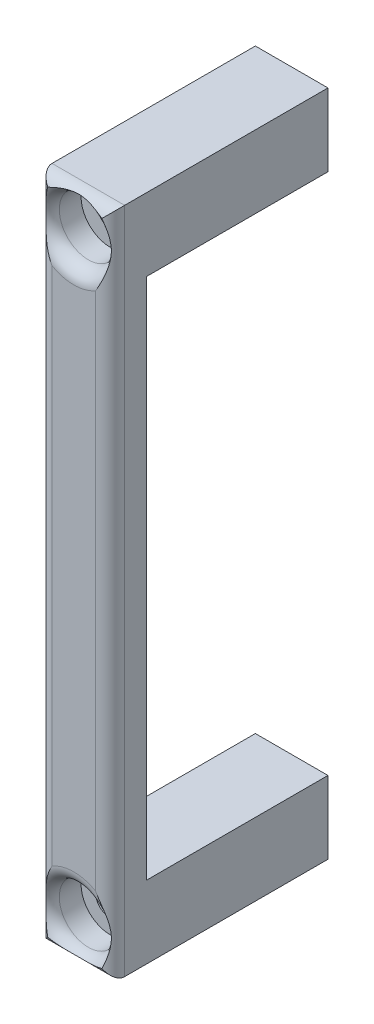
ISO-10303-21;
HEADER;
FILE_DESCRIPTION(('STEP AP214'),'2;1');
FILE_NAME('part.step','',(''),(''),'','','');
FILE_SCHEMA(('AUTOMOTIVE_DESIGN { 1 0 10303 214 1 1 1 1 }'));
ENDSEC;
DATA;
#1=APPLICATION_CONTEXT('core data for automotive mechanical design processes');
#2=APPLICATION_PROTOCOL_DEFINITION('international standard','automotive_design',2000,#1);
#3=PRODUCT_CONTEXT('',#1,'mechanical');
#4=PRODUCT('Part','Part','',(#3));
#5=PRODUCT_RELATED_PRODUCT_CATEGORY('part','',(#4));
#6=PRODUCT_DEFINITION_FORMATION('','',#4);
#7=PRODUCT_DEFINITION_CONTEXT('part definition',#1,'design');
#8=PRODUCT_DEFINITION('design','',#6,#7);
#9=PRODUCT_DEFINITION_SHAPE('','',#8);
#10=(LENGTH_UNIT() NAMED_UNIT(*) SI_UNIT(.MILLI.,.METRE.));
#11=(NAMED_UNIT(*) PLANE_ANGLE_UNIT() SI_UNIT($,.RADIAN.));
#12=(NAMED_UNIT(*) SI_UNIT($,.STERADIAN.) SOLID_ANGLE_UNIT());
#13=UNCERTAINTY_MEASURE_WITH_UNIT(LENGTH_MEASURE(1.E-05),#10,'distance_accuracy_value','');
#14=(GEOMETRIC_REPRESENTATION_CONTEXT(3) GLOBAL_UNCERTAINTY_ASSIGNED_CONTEXT((#13)) GLOBAL_UNIT_ASSIGNED_CONTEXT((#10,
#11,#12)) REPRESENTATION_CONTEXT('',''));
#15=CARTESIAN_POINT('',(0.,0.,0.));
#16=DIRECTION('',(0.,0.,1.));
#17=DIRECTION('',(1.,0.,0.));
#18=AXIS2_PLACEMENT_3D('',#15,#16,#17);
#19=CARTESIAN_POINT('',(0.,0.,25.));
#20=DIRECTION('',(0.,0.,-1.));
#21=DIRECTION('',(-1.,0.,0.));
#22=AXIS2_PLACEMENT_3D('',#19,#20,#21);
#23=CYLINDRICAL_SURFACE('',#22,2.);
#24=CARTESIAN_POINT('',(0.,0.,0.));
#25=DIRECTION('',(0.,0.,1.));
#26=DIRECTION('',(1.,0.,0.));
#27=AXIS2_PLACEMENT_3D('',#24,#25,#26);
#28=CIRCLE('',#27,2.);
#29=CARTESIAN_POINT('',(2.,0.,0.));
#30=VERTEX_POINT('',#29);
#31=EDGE_CURVE('E301',#30,#30,#28,.T.);
#32=ORIENTED_EDGE('',*,*,#31,.F.);
#33=EDGE_LOOP('',(#32));
#34=FACE_BOUND('',#33,.T.);
#35=CARTESIAN_POINT('',(0.,0.,25.));
#36=DIRECTION('',(0.,0.,1.));
#37=DIRECTION('',(1.,0.,0.));
#38=AXIS2_PLACEMENT_3D('',#35,#36,#37);
#39=CIRCLE('',#38,2.);
#40=CARTESIAN_POINT('',(2.,0.,25.));
#41=VERTEX_POINT('',#40);
#42=EDGE_CURVE('E261',#41,#41,#39,.T.);
#43=ORIENTED_EDGE('',*,*,#42,.T.);
#44=EDGE_LOOP('',(#43));
#45=FACE_BOUND('',#44,.T.);
#46=ADVANCED_FACE('F39',(#34,#45),#23,.F.);
#47=CARTESIAN_POINT('',(0.,82.,30.));
#48=DIRECTION('',(0.,0.,-1.));
#49=DIRECTION('',(-1.,0.,0.));
#50=AXIS2_PLACEMENT_3D('',#47,#48,#49);
#51=CYLINDRICAL_SURFACE('',#50,1.75);
#52=CARTESIAN_POINT('',(0.,82.,0.));
#53=DIRECTION('',(0.,0.,-1.));
#54=DIRECTION('',(-1.,0.,0.));
#55=AXIS2_PLACEMENT_3D('',#52,#53,#54);
#56=CIRCLE('',#55,1.75);
#57=CARTESIAN_POINT('',(-1.75000000000001,82.,0.));
#58=VERTEX_POINT('',#57);
#59=EDGE_CURVE('E256',#58,#58,#56,.T.);
#60=ORIENTED_EDGE('',*,*,#59,.T.);
#61=EDGE_LOOP('',(#60));
#62=FACE_BOUND('',#61,.T.);
#63=CARTESIAN_POINT('',(0.,82.,25.));
#64=DIRECTION('',(0.,0.,1.));
#65=DIRECTION('',(1.,0.,0.));
#66=AXIS2_PLACEMENT_3D('',#63,#64,#65);
#67=CIRCLE('',#66,1.75);
#68=CARTESIAN_POINT('',(1.74999999999999,82.,25.));
#69=VERTEX_POINT('',#68);
#70=EDGE_CURVE('E253',#69,#69,#67,.T.);
#71=ORIENTED_EDGE('',*,*,#70,.T.);
#72=EDGE_LOOP('',(#71));
#73=FACE_BOUND('',#72,.T.);
#74=ADVANCED_FACE('F389',(#62,#73),#51,.F.);
#75=CARTESIAN_POINT('',(0.,0.,25.));
#76=DIRECTION('',(0.,0.,-1.));
#77=DIRECTION('',(-1.,0.,0.));
#78=AXIS2_PLACEMENT_3D('',#75,#76,#77);
#79=PLANE('',#78);
#80=DIRECTION('',(0.,-1.,0.));
#81=VECTOR('',#80,1.);
#82=CARTESIAN_POINT('',(-5.,-5.,25.));
#83=LINE('',#82,#81);
#84=CARTESIAN_POINT('',(-5.00000000000002,77.,25.));
#85=VERTEX_POINT('',#84);
#86=CARTESIAN_POINT('',(-5.,5.,25.));
#87=VERTEX_POINT('',#86);
#88=EDGE_CURVE('E286',#85,#87,#83,.T.);
#89=ORIENTED_EDGE('',*,*,#88,.F.);
#90=DIRECTION('',(-1.,0.,0.));
#91=VECTOR('',#90,1.);
#92=CARTESIAN_POINT('',(4.99999999999999,77.,25.));
#93=LINE('',#92,#91);
#94=CARTESIAN_POINT('',(4.99999999999999,77.,25.));
#95=VERTEX_POINT('',#94);
#96=EDGE_CURVE('E260',#95,#85,#93,.T.);
#97=ORIENTED_EDGE('',*,*,#96,.F.);
#98=DIRECTION('',(0.,1.,0.));
#99=VECTOR('',#98,1.);
#100=CARTESIAN_POINT('',(5.,-5.,25.));
#101=LINE('',#100,#99);
#102=CARTESIAN_POINT('',(5.,5.,25.));
#103=VERTEX_POINT('',#102);
#104=EDGE_CURVE('E289',#103,#95,#101,.T.);
#105=ORIENTED_EDGE('',*,*,#104,.F.);
#106=DIRECTION('',(-1.,0.,0.));
#107=VECTOR('',#106,1.);
#108=CARTESIAN_POINT('',(-5.,5.,25.));
#109=LINE('',#108,#107);
#110=EDGE_CURVE('E306',#103,#87,#109,.T.);
#111=ORIENTED_EDGE('',*,*,#110,.T.);
#112=EDGE_LOOP('',(#89,#97,#105,#111));
#113=FACE_BOUND('',#112,.T.);
#114=ADVANCED_FACE('F395',(#113),#79,.T.);
#115=CARTESIAN_POINT('',(0.,0.,0.));
#116=DIRECTION('',(0.,0.,1.));
#117=DIRECTION('',(1.,0.,0.));
#118=AXIS2_PLACEMENT_3D('',#115,#116,#117);
#119=PLANE('',#118);
#120=DIRECTION('',(0.,1.,0.));
#121=VECTOR('',#120,1.);
#122=CARTESIAN_POINT('',(5.,5.,0.));
#123=LINE('',#122,#121);
#124=CARTESIAN_POINT('',(5.,-5.,0.));
#125=VERTEX_POINT('',#124);
#126=CARTESIAN_POINT('',(5.,5.,0.));
#127=VERTEX_POINT('',#126);
#128=EDGE_CURVE('E305',#125,#127,#123,.T.);
#129=ORIENTED_EDGE('',*,*,#128,.F.);
#130=DIRECTION('',(1.,0.,0.));
#131=VECTOR('',#130,1.);
#132=CARTESIAN_POINT('',(-5.,-5.,0.));
#133=LINE('',#132,#131);
#134=CARTESIAN_POINT('',(-5.,-5.,0.));
#135=VERTEX_POINT('',#134);
#136=EDGE_CURVE('E311',#135,#125,#133,.T.);
#137=ORIENTED_EDGE('',*,*,#136,.F.);
#138=DIRECTION('',(0.,-1.,0.));
#139=VECTOR('',#138,1.);
#140=CARTESIAN_POINT('',(-5.,5.,0.));
#141=LINE('',#140,#139);
#142=CARTESIAN_POINT('',(-5.,5.,0.));
#143=VERTEX_POINT('',#142);
#144=EDGE_CURVE('E318',#143,#135,#141,.T.);
#145=ORIENTED_EDGE('',*,*,#144,.F.);
#146=DIRECTION('',(-1.,0.,0.));
#147=VECTOR('',#146,1.);
#148=CARTESIAN_POINT('',(-5.,5.,0.));
#149=LINE('',#148,#147);
#150=EDGE_CURVE('E315',#127,#143,#149,.T.);
#151=ORIENTED_EDGE('',*,*,#150,.F.);
#152=EDGE_LOOP('',(#129,#137,#145,#151));
#153=FACE_BOUND('',#152,.T.);
#154=ORIENTED_EDGE('',*,*,#31,.T.);
#155=EDGE_LOOP('',(#154));
#156=FACE_BOUND('',#155,.T.);
#157=ADVANCED_FACE('F403',(#153,#156),#119,.F.);
#158=CARTESIAN_POINT('',(5.,5.,25.));
#159=DIRECTION('',(-1.,0.,0.));
#160=DIRECTION('',(0.,-1.,0.));
#161=AXIS2_PLACEMENT_3D('',#158,#159,#160);
#162=PLANE('',#161);
#163=DIRECTION('',(0.,0.,-1.));
#164=VECTOR('',#163,1.);
#165=CARTESIAN_POINT('',(4.99999999999998,87.,30.));
#166=LINE('',#165,#164);
#167=CARTESIAN_POINT('',(4.99999999999998,87.,28.));
#168=VERTEX_POINT('',#167);
#169=CARTESIAN_POINT('',(4.99999999999999,87.,0.));
#170=VERTEX_POINT('',#169);
#171=EDGE_CURVE('E297',#168,#170,#166,.T.);
#172=ORIENTED_EDGE('',*,*,#171,.F.);
#173=DIRECTION('',(0.,1.,0.));
#174=VECTOR('',#173,1.);
#175=CARTESIAN_POINT('',(5.,5.,28.));
#176=LINE('',#175,#174);
#177=CARTESIAN_POINT('',(5.,-5.,28.));
#178=VERTEX_POINT('',#177);
#179=EDGE_CURVE('E146',#168,#178,#176,.F.);
#180=ORIENTED_EDGE('',*,*,#179,.T.);
#181=DIRECTION('',(0.,0.,-1.));
#182=VECTOR('',#181,1.);
#183=CARTESIAN_POINT('',(5.,-5.,25.));
#184=LINE('',#183,#182);
#185=EDGE_CURVE('E310',#178,#125,#184,.T.);
#186=ORIENTED_EDGE('',*,*,#185,.T.);
#187=ORIENTED_EDGE('',*,*,#128,.T.);
#188=DIRECTION('',(0.,0.,-1.));
#189=VECTOR('',#188,1.);
#190=CARTESIAN_POINT('',(5.,5.,25.));
#191=LINE('',#190,#189);
#192=EDGE_CURVE('E334',#103,#127,#191,.T.);
#193=ORIENTED_EDGE('',*,*,#192,.F.);
#194=ORIENTED_EDGE('',*,*,#104,.T.);
#195=DIRECTION('',(0.,0.,1.));
#196=VECTOR('',#195,1.);
#197=CARTESIAN_POINT('',(4.99999999999999,77.,0.));
#198=LINE('',#197,#196);
#199=CARTESIAN_POINT('',(4.99999999999999,77.,0.));
#200=VERTEX_POINT('',#199);
#201=EDGE_CURVE('E93',#200,#95,#198,.T.);
#202=ORIENTED_EDGE('',*,*,#201,.F.);
#203=DIRECTION('',(0.,-1.,0.));
#204=VECTOR('',#203,1.);
#205=CARTESIAN_POINT('',(4.99999999999999,77.,0.));
#206=LINE('',#205,#204);
#207=EDGE_CURVE('E270',#170,#200,#206,.T.);
#208=ORIENTED_EDGE('',*,*,#207,.F.);
#209=EDGE_LOOP('',(#172,#180,#186,#187,#193,#194,#202,#208));
#210=FACE_BOUND('',#209,.T.);
#211=ADVANCED_FACE('F359',(#210),#162,.F.);
#212=CARTESIAN_POINT('',(-5.,5.,25.));
#213=DIRECTION('',(0.,-1.,0.));
#214=DIRECTION('',(0.,0.,-1.));
#215=AXIS2_PLACEMENT_3D('',#212,#213,#214);
#216=PLANE('',#215);
#217=ORIENTED_EDGE('',*,*,#150,.T.);
#218=DIRECTION('',(0.,0.,-1.));
#219=VECTOR('',#218,1.);
#220=CARTESIAN_POINT('',(-5.,5.,25.));
#221=LINE('',#220,#219);
#222=EDGE_CURVE('E330',#87,#143,#221,.T.);
#223=ORIENTED_EDGE('',*,*,#222,.F.);
#224=ORIENTED_EDGE('',*,*,#110,.F.);
#225=ORIENTED_EDGE('',*,*,#192,.T.);
#226=EDGE_LOOP('',(#217,#223,#224,#225));
#227=FACE_BOUND('',#226,.T.);
#228=ADVANCED_FACE('F412',(#227),#216,.F.);
#229=CARTESIAN_POINT('',(-5.,5.,25.));
#230=DIRECTION('',(1.,0.,0.));
#231=DIRECTION('',(0.,0.,-1.));
#232=AXIS2_PLACEMENT_3D('',#229,#230,#231);
#233=PLANE('',#232);
#234=DIRECTION('',(0.,0.,-1.));
#235=VECTOR('',#234,1.);
#236=CARTESIAN_POINT('',(-5.,-5.,25.));
#237=LINE('',#236,#235);
#238=CARTESIAN_POINT('',(-5.,-5.,28.));
#239=VERTEX_POINT('',#238);
#240=EDGE_CURVE('E327',#239,#135,#237,.T.);
#241=ORIENTED_EDGE('',*,*,#240,.F.);
#242=DIRECTION('',(0.,-1.,0.));
#243=VECTOR('',#242,1.);
#244=CARTESIAN_POINT('',(-5.,5.,28.));
#245=LINE('',#244,#243);
#246=CARTESIAN_POINT('',(-5.00000000000002,87.,28.));
#247=VERTEX_POINT('',#246);
#248=EDGE_CURVE('E173',#239,#247,#245,.F.);
#249=ORIENTED_EDGE('',*,*,#248,.T.);
#250=DIRECTION('',(0.,0.,-1.));
#251=VECTOR('',#250,1.);
#252=CARTESIAN_POINT('',(-5.00000000000002,87.,30.));
#253=LINE('',#252,#251);
#254=CARTESIAN_POINT('',(-5.00000000000002,87.,0.));
#255=VERTEX_POINT('',#254);
#256=EDGE_CURVE('E293',#247,#255,#253,.T.);
#257=ORIENTED_EDGE('',*,*,#256,.T.);
#258=DIRECTION('',(0.,1.,0.));
#259=VECTOR('',#258,1.);
#260=CARTESIAN_POINT('',(-5.00000000000002,77.,0.));
#261=LINE('',#260,#259);
#262=CARTESIAN_POINT('',(-5.00000000000002,77.,0.));
#263=VERTEX_POINT('',#262);
#264=EDGE_CURVE('E262',#263,#255,#261,.T.);
#265=ORIENTED_EDGE('',*,*,#264,.F.);
#266=DIRECTION('',(0.,0.,1.));
#267=VECTOR('',#266,1.);
#268=CARTESIAN_POINT('',(-5.00000000000002,77.,0.));
#269=LINE('',#268,#267);
#270=EDGE_CURVE('E278',#263,#85,#269,.T.);
#271=ORIENTED_EDGE('',*,*,#270,.T.);
#272=ORIENTED_EDGE('',*,*,#88,.T.);
#273=ORIENTED_EDGE('',*,*,#222,.T.);
#274=ORIENTED_EDGE('',*,*,#144,.T.);
#275=EDGE_LOOP('',(#241,#249,#257,#265,#271,#272,#273,#274));
#276=FACE_BOUND('',#275,.T.);
#277=ADVANCED_FACE('F369',(#276),#233,.F.);
#278=CARTESIAN_POINT('',(-5.,-5.,25.));
#279=DIRECTION('',(0.,1.,0.));
#280=DIRECTION('',(0.,0.,1.));
#281=AXIS2_PLACEMENT_3D('',#278,#279,#280);
#282=PLANE('',#281);
#283=ORIENTED_EDGE('',*,*,#185,.F.);
#284=DIRECTION('',(1.,0.,0.));
#285=VECTOR('',#284,1.);
#286=CARTESIAN_POINT('',(-5.,-5.,28.));
#287=LINE('',#286,#285);
#288=EDGE_CURVE('E64',#178,#239,#287,.F.);
#289=ORIENTED_EDGE('',*,*,#288,.T.);
#290=ORIENTED_EDGE('',*,*,#240,.T.);
#291=ORIENTED_EDGE('',*,*,#136,.T.);
#292=EDGE_LOOP('',(#283,#289,#290,#291));
#293=FACE_BOUND('',#292,.T.);
#294=ADVANCED_FACE('F407',(#293),#282,.F.);
#295=CARTESIAN_POINT('',(0.,0.,30.));
#296=DIRECTION('',(0.,0.,-1.));
#297=DIRECTION('',(-1.,0.,0.));
#298=AXIS2_PLACEMENT_3D('',#295,#296,#297);
#299=PLANE('',#298);
#300=DIRECTION('',(0.,1.,0.));
#301=VECTOR('',#300,1.);
#302=CARTESIAN_POINT('',(3.,0.,30.));
#303=LINE('',#302,#301);
#304=CARTESIAN_POINT('',(3.,5.19615242270663,30.));
#305=VERTEX_POINT('',#304);
#306=CARTESIAN_POINT('',(2.99999999999999,76.8038475772934,30.));
#307=VERTEX_POINT('',#306);
#308=EDGE_CURVE('E147',#305,#307,#303,.T.);
#309=ORIENTED_EDGE('',*,*,#308,.T.);
#310=CARTESIAN_POINT('',(0.,82.,30.));
#311=DIRECTION('',(0.,0.,-1.));
#312=DIRECTION('',(-1.,0.,0.));
#313=AXIS2_PLACEMENT_3D('',#310,#311,#312);
#314=CIRCLE('',#313,6.);
#315=CARTESIAN_POINT('',(-3.,76.8038475772933,30.));
#316=VERTEX_POINT('',#315);
#317=EDGE_CURVE('E135',#307,#316,#314,.T.);
#318=ORIENTED_EDGE('',*,*,#317,.T.);
#319=DIRECTION('',(0.,-1.,0.));
#320=VECTOR('',#319,1.);
#321=CARTESIAN_POINT('',(-3.,0.,30.));
#322=LINE('',#321,#320);
#323=CARTESIAN_POINT('',(-3.,5.19615242270663,30.));
#324=VERTEX_POINT('',#323);
#325=EDGE_CURVE('E163',#316,#324,#322,.T.);
#326=ORIENTED_EDGE('',*,*,#325,.T.);
#327=CARTESIAN_POINT('',(0.,0.,30.));
#328=DIRECTION('',(0.,0.,-1.));
#329=DIRECTION('',(-1.,0.,0.));
#330=AXIS2_PLACEMENT_3D('',#327,#328,#329);
#331=CIRCLE('',#330,6.);
#332=EDGE_CURVE('E161',#324,#305,#331,.T.);
#333=ORIENTED_EDGE('',*,*,#332,.T.);
#334=EDGE_LOOP('',(#309,#318,#326,#333));
#335=FACE_BOUND('',#334,.T.);
#336=ADVANCED_FACE('F159',(#335),#299,.F.);
#337=CARTESIAN_POINT('',(-5.00000000000002,87.,30.));
#338=DIRECTION('',(0.,-1.,0.));
#339=DIRECTION('',(0.,0.,-1.));
#340=AXIS2_PLACEMENT_3D('',#337,#338,#339);
#341=PLANE('',#340);
#342=ORIENTED_EDGE('',*,*,#256,.F.);
#343=DIRECTION('',(-1.,0.,0.));
#344=VECTOR('',#343,1.);
#345=CARTESIAN_POINT('',(-5.00000000000002,87.,28.));
#346=LINE('',#345,#344);
#347=EDGE_CURVE('E338',#247,#168,#346,.F.);
#348=ORIENTED_EDGE('',*,*,#347,.T.);
#349=ORIENTED_EDGE('',*,*,#171,.T.);
#350=DIRECTION('',(1.,0.,0.));
#351=VECTOR('',#350,1.);
#352=CARTESIAN_POINT('',(4.99999999999999,87.,0.));
#353=LINE('',#352,#351);
#354=EDGE_CURVE('E266',#255,#170,#353,.T.);
#355=ORIENTED_EDGE('',*,*,#354,.F.);
#356=EDGE_LOOP('',(#342,#348,#349,#355));
#357=FACE_BOUND('',#356,.T.);
#358=ADVANCED_FACE('F352',(#357),#341,.F.);
#359=CARTESIAN_POINT('',(0.,0.,0.));
#360=DIRECTION('',(0.,0.,1.));
#361=DIRECTION('',(1.,0.,0.));
#362=AXIS2_PLACEMENT_3D('',#359,#360,#361);
#363=PLANE('',#362);
#364=ORIENTED_EDGE('',*,*,#264,.T.);
#365=ORIENTED_EDGE('',*,*,#354,.T.);
#366=ORIENTED_EDGE('',*,*,#207,.T.);
#367=DIRECTION('',(-1.,0.,0.));
#368=VECTOR('',#367,1.);
#369=CARTESIAN_POINT('',(4.99999999999999,77.,0.));
#370=LINE('',#369,#368);
#371=EDGE_CURVE('E274',#200,#263,#370,.T.);
#372=ORIENTED_EDGE('',*,*,#371,.T.);
#373=EDGE_LOOP('',(#364,#365,#366,#372));
#374=FACE_BOUND('',#373,.T.);
#375=ORIENTED_EDGE('',*,*,#59,.F.);
#376=EDGE_LOOP('',(#375));
#377=FACE_BOUND('',#376,.T.);
#378=ADVANCED_FACE('F363',(#374,#377),#363,.F.);
#379=CARTESIAN_POINT('',(4.99999999999999,77.,0.));
#380=DIRECTION('',(0.,1.,0.));
#381=DIRECTION('',(0.,0.,1.));
#382=AXIS2_PLACEMENT_3D('',#379,#380,#381);
#383=PLANE('',#382);
#384=ORIENTED_EDGE('',*,*,#96,.T.);
#385=ORIENTED_EDGE('',*,*,#270,.F.);
#386=ORIENTED_EDGE('',*,*,#371,.F.);
#387=ORIENTED_EDGE('',*,*,#201,.T.);
#388=EDGE_LOOP('',(#384,#385,#386,#387));
#389=FACE_BOUND('',#388,.T.);
#390=ADVANCED_FACE('F453',(#389),#383,.F.);
#391=CARTESIAN_POINT('',(0.,82.,25.));
#392=DIRECTION('',(0.,0.,1.));
#393=DIRECTION('',(1.,0.,0.));
#394=AXIS2_PLACEMENT_3D('',#391,#392,#393);
#395=CYLINDRICAL_SURFACE('',#394,4.);
#396=CARTESIAN_POINT('',(0.,82.,28.));
#397=DIRECTION('',(0.,0.,-1.));
#398=DIRECTION('',(-1.,0.,0.));
#399=AXIS2_PLACEMENT_3D('',#396,#397,#398);
#400=CIRCLE('',#399,4.);
#401=CARTESIAN_POINT('',(-4.00000000000001,82.,28.));
#402=VERTEX_POINT('',#401);
#403=EDGE_CURVE('E55',#402,#402,#400,.F.);
#404=ORIENTED_EDGE('',*,*,#403,.T.);
#405=EDGE_LOOP('',(#404));
#406=FACE_BOUND('',#405,.T.);
#407=CARTESIAN_POINT('',(0.,82.,25.));
#408=DIRECTION('',(0.,0.,1.));
#409=DIRECTION('',(1.,0.,0.));
#410=AXIS2_PLACEMENT_3D('',#407,#408,#409);
#411=CIRCLE('',#410,4.);
#412=CARTESIAN_POINT('',(3.99999999999999,82.,25.));
#413=VERTEX_POINT('',#412);
#414=EDGE_CURVE('E244',#413,#413,#411,.T.);
#415=ORIENTED_EDGE('',*,*,#414,.F.);
#416=EDGE_LOOP('',(#415));
#417=FACE_BOUND('',#416,.T.);
#418=ADVANCED_FACE('F460',(#406,#417),#395,.F.);
#419=CARTESIAN_POINT('',(0.,82.,25.));
#420=DIRECTION('',(0.,0.,1.));
#421=DIRECTION('',(1.,0.,0.));
#422=AXIS2_PLACEMENT_3D('',#419,#420,#421);
#423=PLANE('',#422);
#424=ORIENTED_EDGE('',*,*,#70,.F.);
#425=EDGE_LOOP('',(#424));
#426=FACE_BOUND('',#425,.T.);
#427=ORIENTED_EDGE('',*,*,#414,.T.);
#428=EDGE_LOOP('',(#427));
#429=FACE_BOUND('',#428,.T.);
#430=ADVANCED_FACE('F466',(#426,#429),#423,.T.);
#431=CARTESIAN_POINT('',(0.,0.,25.));
#432=DIRECTION('',(0.,0.,1.));
#433=DIRECTION('',(1.,0.,0.));
#434=AXIS2_PLACEMENT_3D('',#431,#432,#433);
#435=CYLINDRICAL_SURFACE('',#434,4.);
#436=CARTESIAN_POINT('',(0.,0.,28.));
#437=DIRECTION('',(0.,0.,-1.));
#438=DIRECTION('',(-1.,0.,0.));
#439=AXIS2_PLACEMENT_3D('',#436,#437,#438);
#440=CIRCLE('',#439,4.);
#441=CARTESIAN_POINT('',(-4.,0.,28.));
#442=VERTEX_POINT('',#441);
#443=EDGE_CURVE('E11',#442,#442,#440,.F.);
#444=ORIENTED_EDGE('',*,*,#443,.T.);
#445=EDGE_LOOP('',(#444));
#446=FACE_BOUND('',#445,.T.);
#447=CARTESIAN_POINT('',(0.,0.,25.));
#448=DIRECTION('',(0.,0.,1.));
#449=DIRECTION('',(1.,0.,0.));
#450=AXIS2_PLACEMENT_3D('',#447,#448,#449);
#451=CIRCLE('',#450,4.);
#452=CARTESIAN_POINT('',(4.,0.,25.));
#453=VERTEX_POINT('',#452);
#454=EDGE_CURVE('E247',#453,#453,#451,.T.);
#455=ORIENTED_EDGE('',*,*,#454,.F.);
#456=EDGE_LOOP('',(#455));
#457=FACE_BOUND('',#456,.T.);
#458=ADVANCED_FACE('F384',(#446,#457),#435,.F.);
#459=CARTESIAN_POINT('',(0.,0.,25.));
#460=DIRECTION('',(0.,0.,1.));
#461=DIRECTION('',(1.,0.,0.));
#462=AXIS2_PLACEMENT_3D('',#459,#460,#461);
#463=PLANE('',#462);
#464=ORIENTED_EDGE('',*,*,#42,.F.);
#465=EDGE_LOOP('',(#464));
#466=FACE_BOUND('',#465,.T.);
#467=ORIENTED_EDGE('',*,*,#454,.T.);
#468=EDGE_LOOP('',(#467));
#469=FACE_BOUND('',#468,.T.);
#470=ADVANCED_FACE('F378',(#466,#469),#463,.T.);
#471=CARTESIAN_POINT('',(0.,0.,28.));
#472=DIRECTION('',(0.,0.,-1.));
#473=DIRECTION('',(-1.,0.,0.));
#474=AXIS2_PLACEMENT_3D('',#471,#472,#473);
#475=TOROIDAL_SURFACE('',#474,6.,2.);
#476=ORIENTED_EDGE('',*,*,#443,.F.);
#477=EDGE_LOOP('',(#476));
#478=FACE_BOUND('',#477,.T.);
#479=CARTESIAN_POINT('',(5.00019999999861,-3.11099999777855,29.9969173744783));
#480=CARTESIAN_POINT('',(4.78116981004482,-3.23271680702084,29.9900974219239));
#481=CARTESIAN_POINT('',(4.55926815997938,-3.34797876905791,29.9726166902616));
#482=CARTESIAN_POINT('',(4.11067445499725,-3.56402388939578,29.9220272094967));
#483=CARTESIAN_POINT('',(3.88399115002759,-3.66483123951626,29.8889449793927));
#484=CARTESIAN_POINT('',(3.42153207017032,-3.85265081494481,29.8120348249091));
#485=CARTESIAN_POINT('',(3.18566514861099,-3.93935231312616,29.7680081338258));
#486=CARTESIAN_POINT('',(2.70897041859192,-4.09546078485156,29.6757595187666));
#487=CARTESIAN_POINT('',(2.46814099137149,-4.16486201520326,29.6275362087821));
#488=CARTESIAN_POINT('',(2.0339175123409,-4.2721999389642,29.5443705623401));
#489=CARTESIAN_POINT('',(1.84151874812398,-4.31369512393481,29.5088101350171));
#490=CARTESIAN_POINT('',(1.45344754783262,-4.38472701870398,29.443903520854));
#491=CARTESIAN_POINT('',(1.25777601841027,-4.41426698512921,29.4145556427427));
#492=CARTESIAN_POINT('',(0.963363384687219,-4.44896786491435,29.3786816701515));
#493=CARTESIAN_POINT('',(0.86566095387469,-4.45890201979804,29.3681209490753));
#494=CARTESIAN_POINT('',(0.669708224427629,-4.47561579938803,29.3500779344339));
#495=CARTESIAN_POINT('',(0.571458002674212,-4.48239585602063,29.3425952193788));
#496=CARTESIAN_POINT('',(0.374610514945707,-4.49274176510635,29.3310831709824));
#497=CARTESIAN_POINT('',(0.276013349565334,-4.49630848273608,29.3270529080987));
#498=CARTESIAN_POINT('',(0.0786724775923021,-4.5001970163577,29.3226555280097));
#499=CARTESIAN_POINT('',(-0.0200712281871276,-4.50051885029027,29.3222883905513));
#500=CARTESIAN_POINT('',(-0.217817213956795,-4.49790918319039,29.325244296961));
#501=CARTESIAN_POINT('',(-0.316819140356569,-4.49496593195207,29.3285806688384));
#502=CARTESIAN_POINT('',(-0.51449584880338,-4.48583727350246,29.3387798717306));
#503=CARTESIAN_POINT('',(-0.613170586976535,-4.4796514478744,29.3456431578508));
#504=CARTESIAN_POINT('',(-0.908452528876772,-4.45630184187053,29.371032579742));
#505=CARTESIAN_POINT('',(-1.10428875982246,-4.43434633511382,29.3943576828774));
#506=CARTESIAN_POINT('',(-1.49514942883328,-4.37795721344412,29.4501015400717));
#507=CARTESIAN_POINT('',(-1.69013673543259,-4.34337878988861,29.4826247971722));
#508=CARTESIAN_POINT('',(-2.07682895597308,-4.26245369566322,29.5521135865302));
#509=CARTESIAN_POINT('',(-2.2685335444819,-4.21610586536004,29.5890795563366));
#510=CARTESIAN_POINT('',(-2.68052292377077,-4.10355654093406,29.6696437471915));
#511=CARTESIAN_POINT('',(-2.90024027988735,-4.03533283683216,29.7133195967586));
#512=CARTESIAN_POINT('',(-3.33553952340038,-3.88452967007266,29.7958295804092));
#513=CARTESIAN_POINT('',(-3.55112276083457,-3.80195498566821,29.8346653186724));
#514=CARTESIAN_POINT('',(-3.97469630709438,-3.62476895179621,29.9022399385854));
#515=CARTESIAN_POINT('',(-4.1827532383087,-3.53037969406188,29.9311354455705));
#516=CARTESIAN_POINT('',(-4.59476429087379,-3.32948659452086,29.9753501777786));
#517=CARTESIAN_POINT('',(-4.79871177472527,-3.22296475528441,29.9906489297616));
#518=CARTESIAN_POINT('',(-5.00019999999861,-3.11099999777855,29.9969173744783));
#519=B_SPLINE_CURVE_WITH_KNOTS('',3,(#479,#480,#481,#482,#483,#484,#485,#486,#487,#488,#489,
#490,#491,#492,#493,#494,#495,#496,#497,#498,#499,#500,#501,#502,#503,#504,#505,#506,#507,#508,
#509,#510,#511,#512,#513,#514,#515,#516,#517,#518),.UNSPECIFIED.,.F.,.F.,(4,2,2,2,2,2,2,2,2,2,2,
2,2,2,2,2,2,2,2,4),(0.,0.751221078669481,1.50116982952755,2.26588585237858,3.03085540193096,
3.63052140253018,4.23002394272441,4.5262582026385,4.82245188389941,5.11856579253304,
5.41467806397761,5.71185943464784,6.00907916258556,6.60360439665484,7.20517605281143,
7.80680700451295,8.50880634732491,9.21057240107812,9.90071151745992,10.5918880550404),.UNSPECIFIED.);
#520=CARTESIAN_POINT('',(3.72792206135616,-3.72792206135856,29.8628283529589));
#521=VERTEX_POINT('',#520);
#522=CARTESIAN_POINT('',(-3.72792206135744,-3.72792206135744,29.8628283529593));
#523=VERTEX_POINT('',#522);
#524=EDGE_CURVE('E43',#521,#523,#519,.T.);
#525=ORIENTED_EDGE('',*,*,#524,.F.);
#526=CARTESIAN_POINT('',(3.,5.19615242270663,30.));
#527=CARTESIAN_POINT('',(3.00160186755272,5.19337791334738,29.9999999951246));
#528=CARTESIAN_POINT('',(3.00320277999991,5.19060282929881,29.999998070791));
#529=CARTESIAN_POINT('',(3.12531338859865,4.97876114544485,29.999705198178));
#530=CARTESIAN_POINT('',(3.24039171009368,4.76644557611097,29.9885629704908));
#531=CARTESIAN_POINT('',(3.45774494005227,4.33669019864894,29.9500415083558));
#532=CARTESIAN_POINT('',(3.56000429418258,4.11924453851682,29.9226427751501));
#533=CARTESIAN_POINT('',(3.75096512580886,3.67851814240633,29.8564258185227));
#534=CARTESIAN_POINT('',(3.83957513608247,3.45520886446083,29.8175352543149));
#535=CARTESIAN_POINT('',(4.00138203293822,3.00432223084512,29.7336443700694));
#536=CARTESIAN_POINT('',(4.07458460395105,2.77674648311655,29.688646313448));
#537=CARTESIAN_POINT('',(4.19591147057781,2.34800749862729,29.6045223058444));
#538=CARTESIAN_POINT('',(4.24608616279609,2.14741922140547,29.565422470482));
#539=CARTESIAN_POINT('',(4.33357397652234,1.74259812895858,29.4915946320452));
#540=CARTESIAN_POINT('',(4.37088575469416,1.53836493541847,29.4568670858303));
#541=CARTESIAN_POINT('',(4.43156859163002,1.12840261417984,29.3972963803612));
#542=CARTESIAN_POINT('',(4.45507480689914,0.92270864975636,29.3723582118401));
#543=CARTESIAN_POINT('',(4.47975346236399,0.612492318231468,29.345536188805));
#544=CARTESIAN_POINT('',(4.48621602759804,0.508826187926869,29.3383600543189));
#545=CARTESIAN_POINT('',(4.49556100233945,0.301128703597948,29.327911827232));
#546=CARTESIAN_POINT('',(4.49844346886562,0.197097355416771,29.324639672454));
#547=CARTESIAN_POINT('',(4.50060257646698,-0.011778924949662,29.322192927436));
#548=CARTESIAN_POINT('',(4.49985385072264,-0.116624457364895,29.3230471632113));
#549=CARTESIAN_POINT('',(4.49470131447594,-0.326110292232125,29.3288652347964));
#550=CARTESIAN_POINT('',(4.49029745772486,-0.430750592070501,29.333829122606));
#551=CARTESIAN_POINT('',(4.47787850927492,-0.639606913734979,29.3475756264337));
#552=CARTESIAN_POINT('',(4.4698618395696,-0.743822730063054,29.3563599110681));
#553=CARTESIAN_POINT('',(4.45029285098441,-0.951592011606754,29.3772634326589));
#554=CARTESIAN_POINT('',(4.43873996558105,-1.05514536797647,29.3893832039494));
#555=CARTESIAN_POINT('',(4.39859511398634,-1.36705779837574,29.4301743616517));
#556=CARTESIAN_POINT('',(4.364666997254,-1.57419017985962,29.4630888613385));
#557=CARTESIAN_POINT('',(4.28350221063761,-1.98472939413115,29.5347770198417));
#558=CARTESIAN_POINT('',(4.23626317159163,-2.18813555683275,29.5735517211237));
#559=CARTESIAN_POINT('',(4.12210619122142,-2.61804880749728,29.6572639647024));
#560=CARTESIAN_POINT('',(4.05341310239554,-2.84405841056997,29.702339037653));
#561=CARTESIAN_POINT('',(3.90082676732762,-3.29168642529166,29.7877822386507));
#562=CARTESIAN_POINT('',(3.81693982226371,-3.51330661520316,29.828152306588));
#563=CARTESIAN_POINT('',(3.63651180847882,-3.94831247292848,29.8984387596189));
#564=CARTESIAN_POINT('',(3.54022731328217,-4.16177458129732,29.9285311603528));
#565=CARTESIAN_POINT('',(3.33488517794456,-4.58442178312434,29.9745673620916));
#566=CARTESIAN_POINT('',(3.22580691947935,-4.79359931637627,29.9904879592726));
#567=CARTESIAN_POINT('',(3.11099999777778,-5.0002,29.9969173744783));
#568=B_SPLINE_CURVE_WITH_KNOTS('',3,(#526,#527,#528,#529,#530,#531,#532,#533,#534,#535,#536,
#537,#538,#539,#540,#541,#542,#543,#544,#545,#546,#547,#548,#549,#550,#551,#552,#553,#554,#555,
#556,#557,#558,#559,#560,#561,#562,#563,#564,#565,#566,#567),.UNSPECIFIED.,.F.,.F.,(4,2,2,2,2,2,
2,2,2,2,2,2,2,2,2,2,2,2,2,2,4),(0.,0.00961124796494826,0.733542753875833,1.45834433497419,
2.18780942001624,2.91700490214541,3.54790320549281,4.17886737664664,4.80354674650371,
5.1157756395264,5.42799955973943,5.7424077458514,6.05681991026038,6.37136953708851,
6.68596958309795,7.32261500088683,7.95937380449651,8.68024005291804,9.40080802622718,
10.1083313457803,10.8170109901874),.UNSPECIFIED.);
#569=EDGE_CURVE('E157',#305,#521,#568,.T.);
#570=ORIENTED_EDGE('',*,*,#569,.F.);
#571=ORIENTED_EDGE('',*,*,#332,.F.);
#572=CARTESIAN_POINT('',(-3.11099999777778,-5.0002,29.9969173744783));
#573=CARTESIAN_POINT('',(-3.23275440341238,-4.7811021875974,29.9900953136514));
#574=CARTESIAN_POINT('',(-3.34804990366757,-4.55913123953609,29.9726058966785));
#575=CARTESIAN_POINT('',(-3.56415278502988,-4.11039607507379,29.9219911569115));
#576=CARTESIAN_POINT('',(-3.66498437312663,-3.88364061346742,29.8888923659322));
#577=CARTESIAN_POINT('',(-3.85278458524872,-3.4211755808511,29.8119697587133));
#578=CARTESIAN_POINT('',(-3.93945218521319,-3.18537771817694,29.7679534592948));
#579=CARTESIAN_POINT('',(-4.0955028826156,-2.70882431054968,29.6757303038754));
#580=CARTESIAN_POINT('',(-4.16488026721214,-2.46806715537343,29.6275220698999));
#581=CARTESIAN_POINT('',(-4.27218680354792,-2.03397064983672,29.5443807374833));
#582=CARTESIAN_POINT('',(-4.31367200859139,-1.84162590532762,29.5088299583994));
#583=CARTESIAN_POINT('',(-4.3846909028134,-1.45366394770534,29.4439378265614));
#584=CARTESIAN_POINT('',(-4.41422780525602,-1.25804762917472,29.4145948053653));
#585=CARTESIAN_POINT('',(-4.44893600165547,-0.963663732571866,29.3787152697033));
#586=CARTESIAN_POINT('',(-4.45887604441572,-0.865934074889207,29.3681487123568));
#587=CARTESIAN_POINT('',(-4.47559985729366,-0.669926447048439,29.3500954237946));
#588=CARTESIAN_POINT('',(-4.48238405963842,-0.571648553844209,29.3426082708369));
#589=CARTESIAN_POINT('',(-4.49273640543474,-0.374746320411806,29.3310892098108));
#590=CARTESIAN_POINT('',(-4.49630544465575,-0.276122084369627,29.327056339368));
#591=CARTESIAN_POINT('',(-4.50019683841166,-0.0787269158197995,29.32265573368));
#592=CARTESIAN_POINT('',(-4.50051921043642,0.0200440158947297,29.3222879786908));
#593=CARTESIAN_POINT('',(-4.497907694619,0.217929931659178,29.3252459869789));
#594=CARTESIAN_POINT('',(-4.49495922666815,0.317044477080496,29.3285882882587));
#595=CARTESIAN_POINT('',(-4.48581279516807,0.514945439641602,29.3388070999239));
#596=CARTESIAN_POINT('',(-4.47961441097853,0.613731812639663,29.3456840678028));
#597=CARTESIAN_POINT('',(-4.45621584603652,0.909353612994959,29.3711247435185));
#598=CARTESIAN_POINT('',(-4.43421275964011,1.10541561447947,29.3944974728199));
#599=CARTESIAN_POINT('',(-4.37776453583136,1.49628035749563,29.4502842872253));
#600=CARTESIAN_POINT('',(-4.3432022040959,1.69105303359099,29.4827828569207));
#601=CARTESIAN_POINT('',(-4.26234110631033,2.07729419373571,29.5522038081881));
#602=CARTESIAN_POINT('',(-4.21604286335297,2.26876282464673,29.5891259925521));
#603=CARTESIAN_POINT('',(-4.09919585956418,2.6964869760158,29.6727635002229));
#604=CARTESIAN_POINT('',(-4.02547582201609,2.93185428770751,29.7195993486967));
#605=CARTESIAN_POINT('',(-3.86153407809417,3.39804646864136,29.8073247578263));
#606=CARTESIAN_POINT('',(-3.77130519829676,3.6288693147418,29.8482117196527));
#607=CARTESIAN_POINT('',(-3.57610316263147,4.0843207556955,29.918018618652));
#608=CARTESIAN_POINT('',(-3.47122709710892,4.30897934091918,29.9470127723551));
#609=CARTESIAN_POINT('',(-3.24775159292697,4.75285090607068,29.9878404208278));
#610=CARTESIAN_POINT('',(-3.12917000384248,4.97207052720274,29.9996959702883));
#611=CARTESIAN_POINT('',(-3.00320278002066,5.19060282964454,29.9999980705093));
#612=CARTESIAN_POINT('',(-3.00160186757803,5.19337791368762,29.9999999948384));
#613=CARTESIAN_POINT('',(-3.,5.19615242270663,30.));
#614=B_SPLINE_CURVE_WITH_KNOTS('',3,(#572,#573,#574,#575,#576,#577,#578,#579,#580,#581,#582,
#583,#584,#585,#586,#587,#588,#589,#590,#591,#592,#593,#594,#595,#596,#597,#598,#599,#600,#601,
#602,#603,#604,#605,#606,#607,#608,#609,#610,#611,#612,#613),.UNSPECIFIED.,.F.,.F.,(4,2,2,2,2,2,
2,2,2,2,2,2,2,2,2,2,2,2,2,2,4),(0.,0.75145256383709,1.50163243504755,2.26611774612605,
3.03085531608571,3.63035437230267,4.22969209752867,4.52601073595356,4.82228877832277,
5.118484249773,5.41467812561137,5.71219764081485,6.00975567381289,6.60497965513081,
7.20590681502522,7.80680719511649,8.55931415876074,9.31214888169718,10.0602113512391,
10.8073103223726,10.8169215703379),.UNSPECIFIED.);
#615=EDGE_CURVE('E211',#523,#324,#614,.T.);
#616=ORIENTED_EDGE('',*,*,#615,.F.);
#617=EDGE_LOOP('',(#525,#570,#571,#616));
#618=FACE_BOUND('',#617,.T.);
#619=ADVANCED_FACE('F225',(#478,#618),#475,.T.);
#620=CARTESIAN_POINT('',(0.,-3.,28.));
#621=DIRECTION('',(1.,0.,0.));
#622=DIRECTION('',(0.,0.,-1.));
#623=AXIS2_PLACEMENT_3D('',#620,#621,#622);
#624=CYLINDRICAL_SURFACE('',#623,2.);
#625=CARTESIAN_POINT('',(-3.,-3.,28.));
#626=DIRECTION('',(0.707106781186547,-0.707106781186547,0.));
#627=DIRECTION('',(-0.707106781186547,-0.707106781186547,0.));
#628=AXIS2_PLACEMENT_3D('',#625,#626,#627);
#629=ELLIPSE('',#628,2.82842712474619,2.);
#630=EDGE_CURVE('E373',#239,#523,#629,.F.);
#631=ORIENTED_EDGE('',*,*,#630,.F.);
#632=ORIENTED_EDGE('',*,*,#288,.F.);
#633=CARTESIAN_POINT('',(3.,-3.,28.));
#634=DIRECTION('',(0.707106781186547,0.707106781186548,0.));
#635=DIRECTION('',(0.707106781186547,-0.707106781186547,0.));
#636=AXIS2_PLACEMENT_3D('',#633,#634,#635);
#637=ELLIPSE('',#636,2.82842712474619,2.);
#638=EDGE_CURVE('E240',#521,#178,#637,.T.);
#639=ORIENTED_EDGE('',*,*,#638,.F.);
#640=ORIENTED_EDGE('',*,*,#524,.T.);
#641=EDGE_LOOP('',(#631,#632,#639,#640));
#642=FACE_BOUND('',#641,.T.);
#643=ADVANCED_FACE('F41',(#642),#624,.T.);
#644=CARTESIAN_POINT('',(3.,0.,28.));
#645=DIRECTION('',(0.,1.,0.));
#646=DIRECTION('',(-1.,0.,0.));
#647=AXIS2_PLACEMENT_3D('',#644,#645,#646);
#648=CYLINDRICAL_SURFACE('',#647,2.);
#649=CARTESIAN_POINT('',(3.11099999777854,87.0001999999986,29.9969173744783));
#650=CARTESIAN_POINT('',(3.23275440341312,86.781102187596,29.9900953136513));
#651=CARTESIAN_POINT('',(3.34804990366831,86.5591312395346,29.9726058966784));
#652=CARTESIAN_POINT('',(3.56415278503059,86.1103960750722,29.9219911569113));
#653=CARTESIAN_POINT('',(3.66498437312733,85.8836406134658,29.8888923659319));
#654=CARTESIAN_POINT('',(3.85278458524939,85.4211755808493,29.811969758713));
#655=CARTESIAN_POINT('',(3.93945218521385,85.185377718175,29.7679534592945));
#656=CARTESIAN_POINT('',(4.09550288261623,84.7088243105476,29.675730303875));
#657=CARTESIAN_POINT('',(4.16488026721274,84.4680671553712,29.6275220698995));
#658=CARTESIAN_POINT('',(4.27218680354843,84.0339706498344,29.5443807374829));
#659=CARTESIAN_POINT('',(4.31367200859185,83.8416259053253,29.508829958399));
#660=CARTESIAN_POINT('',(4.38469090281375,83.4536639477031,29.443937826561));
#661=CARTESIAN_POINT('',(4.41422780525632,83.2580476291725,29.4145948053649));
#662=CARTESIAN_POINT('',(4.44893600165569,82.9636637325697,29.378715269703));
#663=CARTESIAN_POINT('',(4.45887604441592,82.8659340748871,29.3681487123566));
#664=CARTESIAN_POINT('',(4.47559985729381,82.6699264470463,29.3500954237944));
#665=CARTESIAN_POINT('',(4.48238405963854,82.5716485538421,29.3426082708367));
#666=CARTESIAN_POINT('',(4.49273640543481,82.3747463204098,29.3310892098107));
#667=CARTESIAN_POINT('',(4.4963054446558,82.2761220843676,29.3270563393679));
#668=CARTESIAN_POINT('',(4.50019683841167,82.0787269158179,29.32265573368));
#669=CARTESIAN_POINT('',(4.5005192104364,81.9799559841034,29.3222879786908));
#670=CARTESIAN_POINT('',(4.49790769461895,81.782070068339,29.3252459869789));
#671=CARTESIAN_POINT('',(4.49495922666808,81.6829555229177,29.3285882882588));
#672=CARTESIAN_POINT('',(4.48581279516796,81.4850545603566,29.338807099924));
#673=CARTESIAN_POINT('',(4.4796144109784,81.3862681873586,29.345684067803));
#674=CARTESIAN_POINT('',(4.45621584603634,81.0906463870034,29.3711247435187));
#675=CARTESIAN_POINT('',(4.43421275963991,80.8945843855189,29.3944974728201));
#676=CARTESIAN_POINT('',(4.37776453583111,80.5037196425029,29.4502842872255));
#677=CARTESIAN_POINT('',(4.34320220409564,80.3089469664076,29.482782856921));
#678=CARTESIAN_POINT('',(4.26234110631004,79.9227058062631,29.5522038081883));
#679=CARTESIAN_POINT('',(4.21604286335267,79.7312371753521,29.5891259925523));
#680=CARTESIAN_POINT('',(4.09919585956389,79.3035130239833,29.6727635002231));
#681=CARTESIAN_POINT('',(4.02547582201583,79.0681457122918,29.7195993486969));
#682=CARTESIAN_POINT('',(3.86153407809403,78.6019535313583,29.8073247578263));
#683=CARTESIAN_POINT('',(3.77130519829673,78.371130685258,29.8482117196525));
#684=CARTESIAN_POINT('',(3.5761031626315,77.9156792443046,29.9180186186522));
#685=CARTESIAN_POINT('',(3.47122709710889,77.6910206590811,29.9470127723558));
#686=CARTESIAN_POINT('',(3.24775159292717,77.2471490939294,29.987840420827));
#687=CARTESIAN_POINT('',(3.12917000384294,77.0279294727971,29.9996959702854));
#688=CARTESIAN_POINT('',(3.00320278002067,76.8093971703555,29.9999980705093));
#689=CARTESIAN_POINT('',(3.00160186757803,76.8066220863124,29.9999999948385));
#690=CARTESIAN_POINT('',(2.99999999999999,76.8038475772934,30.0000000000001));
#691=B_SPLINE_CURVE_WITH_KNOTS('',3,(#649,#650,#651,#652,#653,#654,#655,#656,#657,#658,#659,
#660,#661,#662,#663,#664,#665,#666,#667,#668,#669,#670,#671,#672,#673,#674,#675,#676,#677,#678,
#679,#680,#681,#682,#683,#684,#685,#686,#687,#688,#689,#690),.UNSPECIFIED.,.F.,.F.,(4,2,2,2,2,2,
2,2,2,2,2,2,2,2,2,2,2,2,2,2,4),(0.,0.751452563837221,1.5016324350478,2.26611774612661,
3.03085531608657,3.63035437230341,4.22969209752933,4.52601073595412,4.82228877832324,
5.11848424977338,5.41467812561163,5.71219764081503,6.00975567381302,6.60497965513082,
7.20590681502496,7.80680719511605,8.55931415875979,9.3121488816955,10.0602113512373,
10.807310322371,10.8169215703364),.UNSPECIFIED.);
#692=CARTESIAN_POINT('',(3.72792206135855,85.7279220613561,29.8628283529589));
#693=VERTEX_POINT('',#692);
#694=EDGE_CURVE('E139',#307,#693,#691,.F.);
#695=ORIENTED_EDGE('',*,*,#694,.F.);
#696=ORIENTED_EDGE('',*,*,#308,.F.);
#697=ORIENTED_EDGE('',*,*,#569,.T.);
#698=ORIENTED_EDGE('',*,*,#638,.T.);
#699=ORIENTED_EDGE('',*,*,#179,.F.);
#700=CARTESIAN_POINT('',(2.99999999999999,85.,28.));
#701=DIRECTION('',(-0.707106781186547,0.707106781186547,0.));
#702=DIRECTION('',(0.707106781186547,0.707106781186548,0.));
#703=AXIS2_PLACEMENT_3D('',#700,#701,#702);
#704=ELLIPSE('',#703,2.82842712474619,2.);
#705=EDGE_CURVE('E154',#693,#168,#704,.T.);
#706=ORIENTED_EDGE('',*,*,#705,.F.);
#707=EDGE_LOOP('',(#695,#696,#697,#698,#699,#706));
#708=FACE_BOUND('',#707,.T.);
#709=ADVANCED_FACE('F151',(#708),#648,.T.);
#710=CARTESIAN_POINT('',(0.,82.,28.));
#711=DIRECTION('',(0.,0.,-1.));
#712=DIRECTION('',(-1.,0.,0.));
#713=AXIS2_PLACEMENT_3D('',#710,#711,#712);
#714=TOROIDAL_SURFACE('',#713,6.,2.);
#715=ORIENTED_EDGE('',*,*,#403,.F.);
#716=EDGE_LOOP('',(#715));
#717=FACE_BOUND('',#716,.T.);
#718=CARTESIAN_POINT('',(-3.,76.8038475772933,30.0000000000001));
#719=CARTESIAN_POINT('',(-3.00160186755269,76.8066220866526,29.9999999951247));
#720=CARTESIAN_POINT('',(-3.00320277999984,76.8093971707012,29.9999980707911));
#721=CARTESIAN_POINT('',(-3.1253133885932,77.0212388545509,29.9997051981752));
#722=CARTESIAN_POINT('',(-3.24039171008699,77.2335544238781,29.9885629704907));
#723=CARTESIAN_POINT('',(-3.45774494004161,77.6633098013276,29.950041508359));
#724=CARTESIAN_POINT('',(-3.56000429416921,77.8807554614538,29.9226427751541));
#725=CARTESIAN_POINT('',(-3.7509651257913,78.3214818575516,29.8564258185294));
#726=CARTESIAN_POINT('',(-3.83957513606345,78.5447911354902,29.8175352543235));
#727=CARTESIAN_POINT('',(-4.00138203291717,78.9956777690922,29.7336443700815));
#728=CARTESIAN_POINT('',(-4.07458460392942,79.2232535168138,29.6886463134617));
#729=CARTESIAN_POINT('',(-4.19591147055878,79.6519925012995,29.6045223058587));
#730=CARTESIAN_POINT('',(-4.24608616277953,79.8525807785248,29.5654224704953));
#731=CARTESIAN_POINT('',(-4.33357397651028,80.2574018709787,29.4915946320561));
#732=CARTESIAN_POINT('',(-4.37088575468414,80.4616350645224,29.4568670858398));
#733=CARTESIAN_POINT('',(-4.43156859162363,80.8715973857684,29.3972963803678));
#734=CARTESIAN_POINT('',(-4.45507480689433,81.0772913501958,29.3723582118453));
#735=CARTESIAN_POINT('',(-4.47975346236117,81.3875076817266,29.3455361888082));
#736=CARTESIAN_POINT('',(-4.48621602759582,81.4911738120333,29.3383600543214));
#737=CARTESIAN_POINT('',(-4.49556100233828,81.6988712963662,29.3279118272333));
#738=CARTESIAN_POINT('',(-4.49844346886491,81.8029026445495,29.3246396724548));
#739=CARTESIAN_POINT('',(-4.50060257646705,82.0117789249201,29.322192927436));
#740=CARTESIAN_POINT('',(-4.49985385072302,82.1166244573375,29.3230471632109));
#741=CARTESIAN_POINT('',(-4.4947013144768,82.3261102922091,29.3288652347954));
#742=CARTESIAN_POINT('',(-4.49029745772589,82.4307505920496,29.3338291226049));
#743=CARTESIAN_POINT('',(-4.47787850927612,82.6396069137185,29.3475756264323));
#744=CARTESIAN_POINT('',(-4.46986183957082,82.7438227300487,29.3563599110667));
#745=CARTESIAN_POINT('',(-4.45029285098549,82.9515920115968,29.3772634326578));
#746=CARTESIAN_POINT('',(-4.438739965582,83.0551453679686,29.3893832039484));
#747=CARTESIAN_POINT('',(-4.39859511398666,83.3670577983743,29.4301743616514));
#748=CARTESIAN_POINT('',(-4.3646669972536,83.5741901798625,29.4630888613389));
#749=CARTESIAN_POINT('',(-4.28350221063523,83.9847293941424,29.5347770198437));
#750=CARTESIAN_POINT('',(-4.236263171588,84.1881355568481,29.5735517211266));
#751=CARTESIAN_POINT('',(-4.12210619121629,84.6180488075148,29.6572639647059));
#752=CARTESIAN_POINT('',(-4.05341310239056,84.8440584105856,29.7023390376561));
#753=CARTESIAN_POINT('',(-3.90082676732319,85.2916864253036,29.7877822386529));
#754=CARTESIAN_POINT('',(-3.8169398222597,85.5133066152133,29.8281523065898));
#755=CARTESIAN_POINT('',(-3.63651180847584,85.9483124729352,29.8984387596199));
#756=CARTESIAN_POINT('',(-3.5402273132798,86.1617745813024,29.9285311603534));
#757=CARTESIAN_POINT('',(-3.33488517794362,86.5844217831261,29.9745673620917));
#758=CARTESIAN_POINT('',(-3.22580691947922,86.7935993163764,29.9904879592726));
#759=CARTESIAN_POINT('',(-3.11099999777855,87.0001999999986,29.9969173744783));
#760=B_SPLINE_CURVE_WITH_KNOTS('',3,(#718,#719,#720,#721,#722,#723,#724,#725,#726,#727,#728,
#729,#730,#731,#732,#733,#734,#735,#736,#737,#738,#739,#740,#741,#742,#743,#744,#745,#746,#747,
#748,#749,#750,#751,#752,#753,#754,#755,#756,#757,#758,#759),.UNSPECIFIED.,.F.,.F.,(4,2,2,2,2,2,
2,2,2,2,2,2,2,2,2,2,2,2,2,2,4),(0.,0.00961124796494457,0.7335427538567,1.45834433493518,
2.18780941995597,2.91700490206443,3.54790320542407,4.17886737659003,4.8035467464596,
5.11577563948854,5.42799955970782,5.74240774582623,6.05681991024167,6.37136953707629,
6.6859695830922,7.32261500089416,7.95937380451696,8.6802400529329,9.40080802623644,
10.1083313457842,10.8170109901858),.UNSPECIFIED.);
#761=CARTESIAN_POINT('',(-3.72792206135745,85.7279220613574,29.8628283529593));
#762=VERTEX_POINT('',#761);
#763=EDGE_CURVE('E141',#316,#762,#760,.T.);
#764=ORIENTED_EDGE('',*,*,#763,.F.);
#765=ORIENTED_EDGE('',*,*,#317,.F.);
#766=ORIENTED_EDGE('',*,*,#694,.T.);
#767=CARTESIAN_POINT('',(-5.00019999999862,85.1109999977785,29.9969173744783));
#768=CARTESIAN_POINT('',(-4.78116981004481,85.2327168070208,29.9900974219239));
#769=CARTESIAN_POINT('',(-4.55926815997936,85.3479787690579,29.9726166902616));
#770=CARTESIAN_POINT('',(-4.11067445499718,85.5640238893958,29.9220272094966));
#771=CARTESIAN_POINT('',(-3.8839911500275,85.6648312395163,29.8889449793927));
#772=CARTESIAN_POINT('',(-3.4215320701702,85.8526508149449,29.8120348249091));
#773=CARTESIAN_POINT('',(-3.18566514861084,85.9393523131262,29.7680081338258));
#774=CARTESIAN_POINT('',(-2.70897041859173,86.0954607848516,29.6757595187666));
#775=CARTESIAN_POINT('',(-2.46814099137128,86.1648620152033,29.627536208782));
#776=CARTESIAN_POINT('',(-2.03391751234067,86.2721999389642,29.54437056234));
#777=CARTESIAN_POINT('',(-1.84151874812375,86.3136951239349,29.508810135017));
#778=CARTESIAN_POINT('',(-1.4534475478324,86.384727018704,29.443903520854));
#779=CARTESIAN_POINT('',(-1.25777601841005,86.4142669851292,29.4145556427427));
#780=CARTESIAN_POINT('',(-0.963363384687003,86.4489678649144,29.3786816701515));
#781=CARTESIAN_POINT('',(-0.865660953874475,86.4589020197981,29.3681209490753));
#782=CARTESIAN_POINT('',(-0.669708224427418,86.4756157993881,29.3500779344339));
#783=CARTESIAN_POINT('',(-0.571458002674003,86.4823958560206,29.3425952193788));
#784=CARTESIAN_POINT('',(-0.374610514945502,86.4927417651063,29.3310831709824));
#785=CARTESIAN_POINT('',(-0.276013349565131,86.4963084827361,29.3270529080987));
#786=CARTESIAN_POINT('',(-0.0786724775921045,86.5001970163577,29.3226555280097));
#787=CARTESIAN_POINT('',(0.0200712281873229,86.5005188502903,29.3222883905513));
#788=CARTESIAN_POINT('',(0.217817213956985,86.4979091831904,29.325244296961));
#789=CARTESIAN_POINT('',(0.316819140356757,86.4949659319521,29.3285806688384));
#790=CARTESIAN_POINT('',(0.514495848803562,86.4858372735024,29.3387798717307));
#791=CARTESIAN_POINT('',(0.613170586976714,86.4796514478744,29.3456431578508));
#792=CARTESIAN_POINT('',(0.908452528876941,86.4563018418705,29.371032579742));
#793=CARTESIAN_POINT('',(1.10428875982263,86.4343463351138,29.3943576828775));
#794=CARTESIAN_POINT('',(1.49514942883343,86.3779572134441,29.4501015400717));
#795=CARTESIAN_POINT('',(1.69013673543273,86.3433787898886,29.4826247971722));
#796=CARTESIAN_POINT('',(2.07682895597321,86.2624536956632,29.5521135865302));
#797=CARTESIAN_POINT('',(2.26853354448202,86.21610586536,29.5890795563366));
#798=CARTESIAN_POINT('',(2.68052292377088,86.103556540934,29.6696437471915));
#799=CARTESIAN_POINT('',(2.90024027988745,86.0353328368321,29.7133195967587));
#800=CARTESIAN_POINT('',(3.33553952340045,85.8845296700726,29.7958295804092));
#801=CARTESIAN_POINT('',(3.55112276083464,85.8019549856682,29.8346653186724));
#802=CARTESIAN_POINT('',(3.97469630709442,85.6247689517962,29.9022399385854));
#803=CARTESIAN_POINT('',(4.18275323830872,85.5303796940618,29.9311354455705));
#804=CARTESIAN_POINT('',(4.5947642908738,85.3294865945208,29.9753501777786));
#805=CARTESIAN_POINT('',(4.79871177472527,85.2229647552844,29.9906489297616));
#806=CARTESIAN_POINT('',(5.0001999999986,85.1109999977785,29.9969173744783));
#807=B_SPLINE_CURVE_WITH_KNOTS('',3,(#767,#768,#769,#770,#771,#772,#773,#774,#775,#776,#777,
#778,#779,#780,#781,#782,#783,#784,#785,#786,#787,#788,#789,#790,#791,#792,#793,#794,#795,#796,
#797,#798,#799,#800,#801,#802,#803,#804,#805,#806),.UNSPECIFIED.,.F.,.F.,(4,2,2,2,2,2,2,2,2,2,2,
2,2,2,2,2,2,2,2,4),(0.,0.751221078669536,1.50116982952768,2.26588585237877,3.03085540193122,
3.63052140253043,4.23002394272464,4.52625820263873,4.82245188389963,5.11856579253325,
5.41467806397781,5.71185943464803,6.00907916258575,6.60360439665501,7.20517605281158,
7.80680700451309,8.50880634732501,9.21057240107818,9.90071151745995,10.5918880550404),.UNSPECIFIED.);
#808=EDGE_CURVE('E183',#762,#693,#807,.T.);
#809=ORIENTED_EDGE('',*,*,#808,.F.);
#810=EDGE_LOOP('',(#764,#765,#766,#809));
#811=FACE_BOUND('',#810,.T.);
#812=ADVANCED_FACE('F137',(#717,#811),#714,.T.);
#813=CARTESIAN_POINT('',(-3.,0.,28.));
#814=DIRECTION('',(0.,-1.,0.));
#815=DIRECTION('',(0.,0.,-1.));
#816=AXIS2_PLACEMENT_3D('',#813,#814,#815);
#817=CYLINDRICAL_SURFACE('',#816,2.);
#818=ORIENTED_EDGE('',*,*,#325,.F.);
#819=ORIENTED_EDGE('',*,*,#763,.T.);
#820=CARTESIAN_POINT('',(-3.,85.,28.));
#821=DIRECTION('',(-0.707106781186547,-0.707106781186547,0.));
#822=DIRECTION('',(0.707106781186547,-0.707106781186547,0.));
#823=AXIS2_PLACEMENT_3D('',#820,#821,#822);
#824=ELLIPSE('',#823,2.82842712474619,2.);
#825=EDGE_CURVE('E179',#247,#762,#824,.F.);
#826=ORIENTED_EDGE('',*,*,#825,.F.);
#827=ORIENTED_EDGE('',*,*,#248,.F.);
#828=ORIENTED_EDGE('',*,*,#630,.T.);
#829=ORIENTED_EDGE('',*,*,#615,.T.);
#830=EDGE_LOOP('',(#818,#819,#826,#827,#828,#829));
#831=FACE_BOUND('',#830,.T.);
#832=ADVANCED_FACE('F198',(#831),#817,.T.);
#833=CARTESIAN_POINT('',(0.,85.,28.));
#834=DIRECTION('',(-1.,0.,0.));
#835=DIRECTION('',(0.,0.,1.));
#836=AXIS2_PLACEMENT_3D('',#833,#834,#835);
#837=CYLINDRICAL_SURFACE('',#836,2.);
#838=ORIENTED_EDGE('',*,*,#705,.T.);
#839=ORIENTED_EDGE('',*,*,#347,.F.);
#840=ORIENTED_EDGE('',*,*,#825,.T.);
#841=ORIENTED_EDGE('',*,*,#808,.T.);
#842=EDGE_LOOP('',(#838,#839,#840,#841));
#843=FACE_BOUND('',#842,.T.);
#844=ADVANCED_FACE('F200',(#843),#837,.T.);
#845=CLOSED_SHELL('',(#46,#74,#114,#157,#211,#228,#277,#294,#336,#358,#378,#390,#418,#430,#458,
#470,#619,#643,#709,#812,#832,#844));
#846=MANIFOLD_SOLID_BREP('B2',#845);
#847=ADVANCED_BREP_SHAPE_REPRESENTATION('',(#18,#846),#14);
#848=SHAPE_DEFINITION_REPRESENTATION(#9,#847);
ENDSEC;
END-ISO-10303-21;
